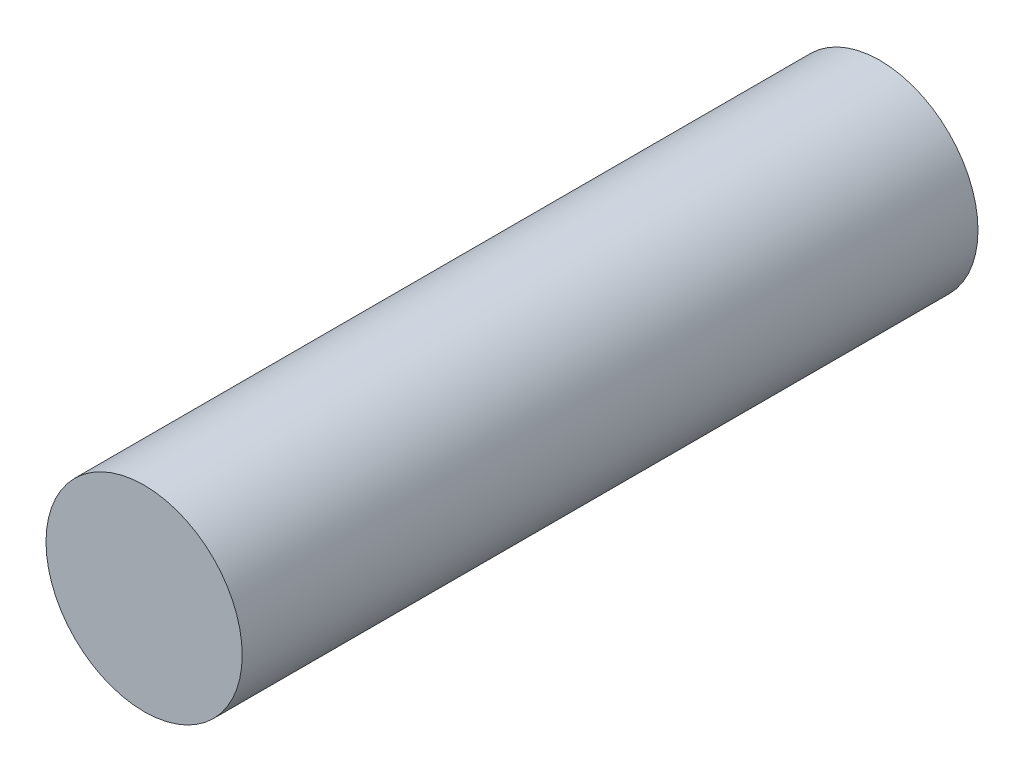
ISO-10303-21;
HEADER;
FILE_DESCRIPTION(('STEP AP214'),'2;1');
FILE_NAME('part.step','',(''),(''),'','','');
FILE_SCHEMA(('AUTOMOTIVE_DESIGN { 1 0 10303 214 1 1 1 1 }'));
ENDSEC;
DATA;
#1=APPLICATION_CONTEXT('core data for automotive mechanical design processes');
#2=APPLICATION_PROTOCOL_DEFINITION('international standard','automotive_design',2000,#1);
#3=PRODUCT_CONTEXT('',#1,'mechanical');
#4=PRODUCT('Part','Part','',(#3));
#5=PRODUCT_RELATED_PRODUCT_CATEGORY('part','',(#4));
#6=PRODUCT_DEFINITION_FORMATION('','',#4);
#7=PRODUCT_DEFINITION_CONTEXT('part definition',#1,'design');
#8=PRODUCT_DEFINITION('design','',#6,#7);
#9=PRODUCT_DEFINITION_SHAPE('','',#8);
#10=(LENGTH_UNIT() NAMED_UNIT(*) SI_UNIT(.MILLI.,.METRE.));
#11=(NAMED_UNIT(*) PLANE_ANGLE_UNIT() SI_UNIT($,.RADIAN.));
#12=(NAMED_UNIT(*) SI_UNIT($,.STERADIAN.) SOLID_ANGLE_UNIT());
#13=UNCERTAINTY_MEASURE_WITH_UNIT(LENGTH_MEASURE(1.E-05),#10,'distance_accuracy_value','');
#14=(GEOMETRIC_REPRESENTATION_CONTEXT(3) GLOBAL_UNCERTAINTY_ASSIGNED_CONTEXT((#13)) GLOBAL_UNIT_ASSIGNED_CONTEXT((#10,
#11,#12)) REPRESENTATION_CONTEXT('',''));
#15=CARTESIAN_POINT('',(0.,0.,0.));
#16=DIRECTION('',(0.,0.,1.));
#17=DIRECTION('',(1.,0.,0.));
#18=AXIS2_PLACEMENT_3D('',#15,#16,#17);
#19=CARTESIAN_POINT('',(0.,0.,76.2));
#20=DIRECTION('',(0.,0.,-1.));
#21=DIRECTION('',(-1.,0.,0.));
#22=AXIS2_PLACEMENT_3D('',#19,#20,#21);
#23=CYLINDRICAL_SURFACE('',#22,10.16);
#24=CARTESIAN_POINT('',(0.,0.,76.2));
#25=DIRECTION('',(0.,0.,1.));
#26=DIRECTION('',(1.,0.,0.));
#27=AXIS2_PLACEMENT_3D('',#24,#25,#26);
#28=CIRCLE('',#27,10.16);
#29=CARTESIAN_POINT('',(-10.16,0.,76.2));
#30=VERTEX_POINT('',#29);
#31=EDGE_CURVE('E10',#30,#30,#28,.T.);
#32=CARTESIAN_POINT('',(0.,0.,0.));
#33=DIRECTION('',(0.,0.,1.));
#34=DIRECTION('',(1.,0.,0.));
#35=AXIS2_PLACEMENT_3D('',#32,#33,#34);
#36=CIRCLE('',#35,10.16);
#37=CARTESIAN_POINT('',(-10.16,0.,0.));
#38=VERTEX_POINT('',#37);
#39=EDGE_CURVE('E42',#38,#38,#36,.T.);
#40=CARTESIAN_POINT('',(-10.16,0.,76.2));
#41=CARTESIAN_POINT('',(-10.16,0.,75.40625));
#42=CARTESIAN_POINT('',(-10.16,0.,74.6125));
#43=CARTESIAN_POINT('',(-10.16,0.,73.025));
#44=CARTESIAN_POINT('',(-10.16,0.,72.23125));
#45=CARTESIAN_POINT('',(-10.16,0.,70.64375));
#46=CARTESIAN_POINT('',(-10.16,0.,69.85));
#47=CARTESIAN_POINT('',(-10.16,0.,68.2625));
#48=CARTESIAN_POINT('',(-10.16,0.,67.46875));
#49=CARTESIAN_POINT('',(-10.16,0.,65.88125));
#50=CARTESIAN_POINT('',(-10.16,0.,65.0875));
#51=CARTESIAN_POINT('',(-10.16,0.,63.5));
#52=CARTESIAN_POINT('',(-10.16,0.,62.70625));
#53=CARTESIAN_POINT('',(-10.16,0.,61.11875));
#54=CARTESIAN_POINT('',(-10.16,0.,60.325));
#55=CARTESIAN_POINT('',(-10.16,0.,58.7375));
#56=CARTESIAN_POINT('',(-10.16,0.,57.94375));
#57=CARTESIAN_POINT('',(-10.16,0.,56.35625));
#58=CARTESIAN_POINT('',(-10.16,0.,55.5625));
#59=CARTESIAN_POINT('',(-10.16,0.,53.975));
#60=CARTESIAN_POINT('',(-10.16,0.,53.18125));
#61=CARTESIAN_POINT('',(-10.16,0.,51.59375));
#62=CARTESIAN_POINT('',(-10.16,0.,50.8));
#63=CARTESIAN_POINT('',(-10.16,0.,49.2125));
#64=CARTESIAN_POINT('',(-10.16,0.,48.41875));
#65=CARTESIAN_POINT('',(-10.16,0.,46.83125));
#66=CARTESIAN_POINT('',(-10.16,0.,46.0375));
#67=CARTESIAN_POINT('',(-10.16,0.,44.45));
#68=CARTESIAN_POINT('',(-10.16,0.,43.65625));
#69=CARTESIAN_POINT('',(-10.16,0.,42.06875));
#70=CARTESIAN_POINT('',(-10.16,0.,41.275));
#71=CARTESIAN_POINT('',(-10.16,0.,39.6875));
#72=CARTESIAN_POINT('',(-10.16,0.,38.89375));
#73=CARTESIAN_POINT('',(-10.16,0.,37.30625));
#74=CARTESIAN_POINT('',(-10.16,0.,36.5125));
#75=CARTESIAN_POINT('',(-10.16,0.,34.925));
#76=CARTESIAN_POINT('',(-10.16,0.,34.13125));
#77=CARTESIAN_POINT('',(-10.16,0.,32.54375));
#78=CARTESIAN_POINT('',(-10.16,0.,31.75));
#79=CARTESIAN_POINT('',(-10.16,0.,30.1625));
#80=CARTESIAN_POINT('',(-10.16,0.,29.36875));
#81=CARTESIAN_POINT('',(-10.16,0.,27.78125));
#82=CARTESIAN_POINT('',(-10.16,0.,26.9875));
#83=CARTESIAN_POINT('',(-10.16,0.,25.4));
#84=CARTESIAN_POINT('',(-10.16,0.,24.60625));
#85=CARTESIAN_POINT('',(-10.16,0.,23.01875));
#86=CARTESIAN_POINT('',(-10.16,0.,22.225));
#87=CARTESIAN_POINT('',(-10.16,0.,20.6375));
#88=CARTESIAN_POINT('',(-10.16,0.,19.84375));
#89=CARTESIAN_POINT('',(-10.16,0.,18.25625));
#90=CARTESIAN_POINT('',(-10.16,0.,17.4625));
#91=CARTESIAN_POINT('',(-10.16,0.,15.875));
#92=CARTESIAN_POINT('',(-10.16,0.,15.08125));
#93=CARTESIAN_POINT('',(-10.16,0.,13.49375));
#94=CARTESIAN_POINT('',(-10.16,0.,12.7));
#95=CARTESIAN_POINT('',(-10.16,0.,11.1125));
#96=CARTESIAN_POINT('',(-10.16,0.,10.31875));
#97=CARTESIAN_POINT('',(-10.16,0.,8.73125));
#98=CARTESIAN_POINT('',(-10.16,0.,7.93750000000001));
#99=CARTESIAN_POINT('',(-10.16,0.,6.35));
#100=CARTESIAN_POINT('',(-10.16,0.,5.55625));
#101=CARTESIAN_POINT('',(-10.16,0.,3.96875));
#102=CARTESIAN_POINT('',(-10.16,0.,3.175));
#103=CARTESIAN_POINT('',(-10.16,0.,1.5875));
#104=CARTESIAN_POINT('',(-10.16,0.,0.793750000000001));
#105=CARTESIAN_POINT('',(-10.16,0.,0.));
#106=B_SPLINE_CURVE_WITH_KNOTS('',3,(#40,#41,#42,#43,#44,#45,#46,#47,#48,#49,#50,#51,#52,#53,
#54,#55,#56,#57,#58,#59,#60,#61,#62,#63,#64,#65,#66,#67,#68,#69,#70,#71,#72,#73,#74,#75,#76,#77,
#78,#79,#80,#81,#82,#83,#84,#85,#86,#87,#88,#89,#90,#91,#92,#93,#94,#95,#96,#97,#98,#99,#100,
#101,#102,#103,#104,#105),.UNSPECIFIED.,.F.,.F.,(4,2,2,2,2,2,2,2,2,2,2,2,2,2,2,2,2,2,2,2,2,2,2,
2,2,2,2,2,2,2,2,2,4),(0.,2.38124999999999,4.76249999999999,7.14374999999999,9.52499999999999,
11.90625,14.2875,16.66875,19.05,21.43125,23.8125,26.19375,28.575,30.95625,33.3375,35.71875,38.1,
40.48125,42.8625,45.24375,47.625,50.00625,52.3875,54.76875,57.15,59.53125,61.9125,64.29375,
66.675,69.05625,71.4375,73.81875,76.2),.UNSPECIFIED.);
#107=EDGE_CURVE('BSEAM39',#30,#38,#106,.T.);
#108=ORIENTED_EDGE('',*,*,#31,.F.);
#109=ORIENTED_EDGE('',*,*,#39,.T.);
#110=ORIENTED_EDGE('',*,*,#107,.T.);
#111=ORIENTED_EDGE('',*,*,#107,.F.);
#112=EDGE_LOOP('',(#108,#110,#109,#111));
#113=FACE_BOUND('',#112,.T.);
#114=ADVANCED_FACE('F39',(#113),#23,.T.);
#115=CARTESIAN_POINT('',(0.,0.,76.2));
#116=DIRECTION('',(0.,0.,1.));
#117=DIRECTION('',(1.,0.,0.));
#118=AXIS2_PLACEMENT_3D('',#115,#116,#117);
#119=PLANE('',#118);
#120=ORIENTED_EDGE('',*,*,#31,.T.);
#121=EDGE_LOOP('',(#120));
#122=FACE_BOUND('',#121,.T.);
#123=ADVANCED_FACE('F56',(#122),#119,.T.);
#124=CARTESIAN_POINT('',(0.,0.,0.));
#125=DIRECTION('',(0.,0.,1.));
#126=DIRECTION('',(1.,0.,0.));
#127=AXIS2_PLACEMENT_3D('',#124,#125,#126);
#128=PLANE('',#127);
#129=ORIENTED_EDGE('',*,*,#39,.F.);
#130=EDGE_LOOP('',(#129));
#131=FACE_BOUND('',#130,.T.);
#132=ADVANCED_FACE('F54',(#131),#128,.F.);
#133=CLOSED_SHELL('',(#114,#123,#132));
#134=MANIFOLD_SOLID_BREP('B2',#133);
#135=ADVANCED_BREP_SHAPE_REPRESENTATION('',(#18,#134),#14);
#136=SHAPE_DEFINITION_REPRESENTATION(#9,#135);
ENDSEC;
END-ISO-10303-21;
